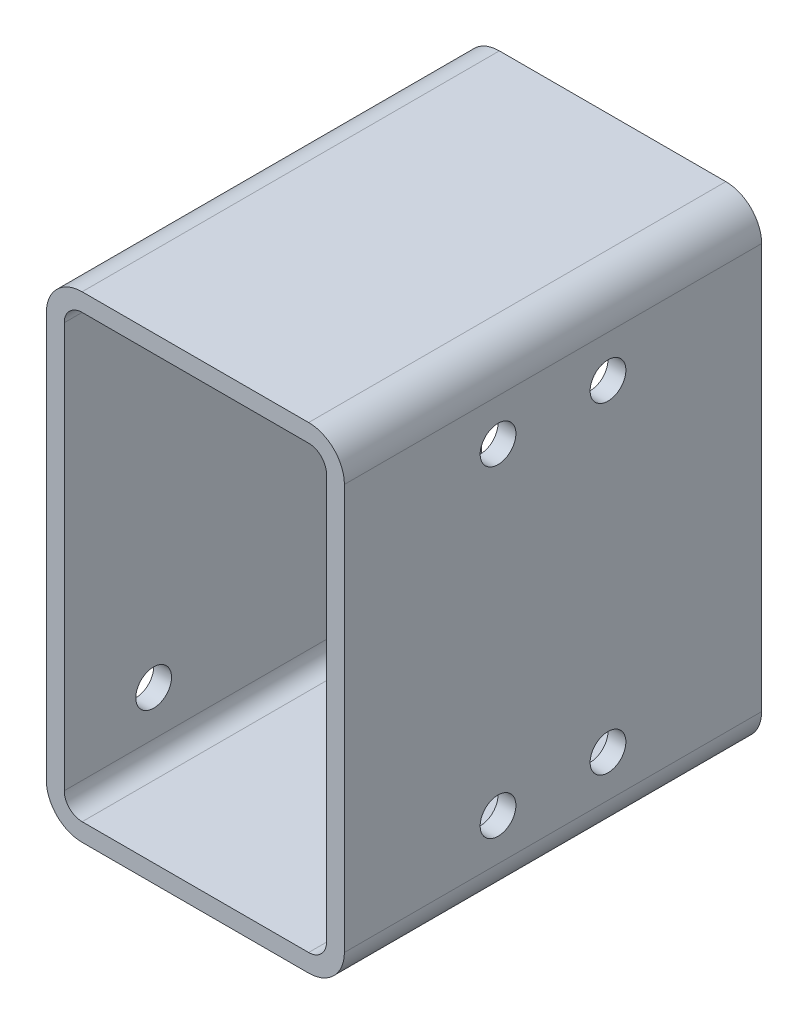
ISO-10303-21;
HEADER;
FILE_DESCRIPTION(('STEP AP214'),'2;1');
FILE_NAME('part.step','',(''),(''),'','','');
FILE_SCHEMA(('AUTOMOTIVE_DESIGN { 1 0 10303 214 1 1 1 1 }'));
ENDSEC;
DATA;
#1=APPLICATION_CONTEXT('core data for automotive mechanical design processes');
#2=APPLICATION_PROTOCOL_DEFINITION('international standard','automotive_design',2000,#1);
#3=PRODUCT_CONTEXT('',#1,'mechanical');
#4=PRODUCT('Part','Part','',(#3));
#5=PRODUCT_RELATED_PRODUCT_CATEGORY('part','',(#4));
#6=PRODUCT_DEFINITION_FORMATION('','',#4);
#7=PRODUCT_DEFINITION_CONTEXT('part definition',#1,'design');
#8=PRODUCT_DEFINITION('design','',#6,#7);
#9=PRODUCT_DEFINITION_SHAPE('','',#8);
#10=(LENGTH_UNIT() NAMED_UNIT(*) SI_UNIT(.MILLI.,.METRE.));
#11=(NAMED_UNIT(*) PLANE_ANGLE_UNIT() SI_UNIT($,.RADIAN.));
#12=(NAMED_UNIT(*) SI_UNIT($,.STERADIAN.) SOLID_ANGLE_UNIT());
#13=UNCERTAINTY_MEASURE_WITH_UNIT(LENGTH_MEASURE(1.E-05),#10,'distance_accuracy_value','');
#14=(GEOMETRIC_REPRESENTATION_CONTEXT(3) GLOBAL_UNCERTAINTY_ASSIGNED_CONTEXT((#13)) GLOBAL_UNIT_ASSIGNED_CONTEXT((#10,
#11,#12)) REPRESENTATION_CONTEXT('',''));
#15=CARTESIAN_POINT('',(0.,0.,0.));
#16=DIRECTION('',(0.,0.,1.));
#17=DIRECTION('',(1.,0.,0.));
#18=AXIS2_PLACEMENT_3D('',#15,#16,#17);
#19=CARTESIAN_POINT('',(19.,34.,35.));
#20=DIRECTION('',(0.,0.,1.));
#21=DIRECTION('',(1.,0.,0.));
#22=AXIS2_PLACEMENT_3D('',#19,#20,#21);
#23=PLANE('',#22);
#24=CARTESIAN_POINT('',(19.,34.,35.));
#25=DIRECTION('',(0.,0.,1.));
#26=DIRECTION('',(1.,0.,0.));
#27=AXIS2_PLACEMENT_3D('',#24,#25,#26);
#28=CIRCLE('',#27,6.00000000000001);
#29=CARTESIAN_POINT('',(25.,34.,35.));
#30=VERTEX_POINT('',#29);
#31=CARTESIAN_POINT('',(19.,40.,35.));
#32=VERTEX_POINT('',#31);
#33=EDGE_CURVE('E215',#30,#32,#28,.T.);
#34=ORIENTED_EDGE('',*,*,#33,.T.);
#35=DIRECTION('',(-1.,0.,0.));
#36=VECTOR('',#35,1.);
#37=CARTESIAN_POINT('',(19.,40.,35.));
#38=LINE('',#37,#36);
#39=CARTESIAN_POINT('',(-19.,40.,35.));
#40=VERTEX_POINT('',#39);
#41=EDGE_CURVE('E218',#32,#40,#38,.T.);
#42=ORIENTED_EDGE('',*,*,#41,.T.);
#43=CARTESIAN_POINT('',(-19.,34.,35.));
#44=DIRECTION('',(0.,0.,1.));
#45=DIRECTION('',(1.,0.,0.));
#46=AXIS2_PLACEMENT_3D('',#43,#44,#45);
#47=CIRCLE('',#46,6.);
#48=CARTESIAN_POINT('',(-25.,34.,35.));
#49=VERTEX_POINT('',#48);
#50=EDGE_CURVE('E221',#40,#49,#47,.T.);
#51=ORIENTED_EDGE('',*,*,#50,.T.);
#52=DIRECTION('',(0.,-1.,0.));
#53=VECTOR('',#52,1.);
#54=CARTESIAN_POINT('',(-25.,34.,35.));
#55=LINE('',#54,#53);
#56=CARTESIAN_POINT('',(-25.,-34.,35.));
#57=VERTEX_POINT('',#56);
#58=EDGE_CURVE('E223',#49,#57,#55,.T.);
#59=ORIENTED_EDGE('',*,*,#58,.T.);
#60=CARTESIAN_POINT('',(-19.,-34.,35.));
#61=DIRECTION('',(0.,0.,1.));
#62=DIRECTION('',(1.,0.,0.));
#63=AXIS2_PLACEMENT_3D('',#60,#61,#62);
#64=CIRCLE('',#63,6.00000000000001);
#65=CARTESIAN_POINT('',(-19.,-40.,35.));
#66=VERTEX_POINT('',#65);
#67=EDGE_CURVE('E225',#57,#66,#64,.T.);
#68=ORIENTED_EDGE('',*,*,#67,.T.);
#69=DIRECTION('',(1.,0.,0.));
#70=VECTOR('',#69,1.);
#71=CARTESIAN_POINT('',(-19.,-40.,35.));
#72=LINE('',#71,#70);
#73=CARTESIAN_POINT('',(19.,-40.,35.));
#74=VERTEX_POINT('',#73);
#75=EDGE_CURVE('E227',#66,#74,#72,.T.);
#76=ORIENTED_EDGE('',*,*,#75,.T.);
#77=CARTESIAN_POINT('',(19.,-34.,35.));
#78=DIRECTION('',(0.,0.,1.));
#79=DIRECTION('',(1.,0.,0.));
#80=AXIS2_PLACEMENT_3D('',#77,#78,#79);
#81=CIRCLE('',#80,6.);
#82=CARTESIAN_POINT('',(25.,-34.,35.));
#83=VERTEX_POINT('',#82);
#84=EDGE_CURVE('E229',#74,#83,#81,.T.);
#85=ORIENTED_EDGE('',*,*,#84,.T.);
#86=DIRECTION('',(0.,1.,0.));
#87=VECTOR('',#86,1.);
#88=CARTESIAN_POINT('',(25.,-34.,35.));
#89=LINE('',#88,#87);
#90=EDGE_CURVE('E231',#83,#30,#89,.T.);
#91=ORIENTED_EDGE('',*,*,#90,.T.);
#92=EDGE_LOOP('',(#34,#42,#51,#59,#68,#76,#85,#91));
#93=FACE_BOUND('',#92,.T.);
#94=DIRECTION('',(0.,1.,0.));
#95=VECTOR('',#94,1.);
#96=CARTESIAN_POINT('',(22.,-34.,35.));
#97=LINE('',#96,#95);
#98=CARTESIAN_POINT('',(22.,-34.,35.));
#99=VERTEX_POINT('',#98);
#100=CARTESIAN_POINT('',(22.,34.,35.));
#101=VERTEX_POINT('',#100);
#102=EDGE_CURVE('E156',#99,#101,#97,.T.);
#103=ORIENTED_EDGE('',*,*,#102,.F.);
#104=CARTESIAN_POINT('',(19.,-34.,35.));
#105=DIRECTION('',(0.,0.,1.));
#106=DIRECTION('',(1.,0.,0.));
#107=AXIS2_PLACEMENT_3D('',#104,#105,#106);
#108=CIRCLE('',#107,3.);
#109=CARTESIAN_POINT('',(19.,-37.,35.));
#110=VERTEX_POINT('',#109);
#111=EDGE_CURVE('E148',#110,#99,#108,.T.);
#112=ORIENTED_EDGE('',*,*,#111,.F.);
#113=DIRECTION('',(1.,0.,0.));
#114=VECTOR('',#113,1.);
#115=CARTESIAN_POINT('',(-19.,-37.,35.));
#116=LINE('',#115,#114);
#117=CARTESIAN_POINT('',(-19.,-37.,35.));
#118=VERTEX_POINT('',#117);
#119=EDGE_CURVE('E182',#118,#110,#116,.T.);
#120=ORIENTED_EDGE('',*,*,#119,.F.);
#121=CARTESIAN_POINT('',(-19.,-34.,35.));
#122=DIRECTION('',(0.,0.,1.));
#123=DIRECTION('',(1.,0.,0.));
#124=AXIS2_PLACEMENT_3D('',#121,#122,#123);
#125=CIRCLE('',#124,3.);
#126=CARTESIAN_POINT('',(-22.,-34.,35.));
#127=VERTEX_POINT('',#126);
#128=EDGE_CURVE('E180',#127,#118,#125,.T.);
#129=ORIENTED_EDGE('',*,*,#128,.F.);
#130=DIRECTION('',(0.,-1.,0.));
#131=VECTOR('',#130,1.);
#132=CARTESIAN_POINT('',(-22.,34.,35.));
#133=LINE('',#132,#131);
#134=CARTESIAN_POINT('',(-22.,34.,35.));
#135=VERTEX_POINT('',#134);
#136=EDGE_CURVE('E178',#135,#127,#133,.T.);
#137=ORIENTED_EDGE('',*,*,#136,.F.);
#138=CARTESIAN_POINT('',(-19.,34.,35.));
#139=DIRECTION('',(0.,0.,1.));
#140=DIRECTION('',(1.,0.,0.));
#141=AXIS2_PLACEMENT_3D('',#138,#139,#140);
#142=CIRCLE('',#141,3.);
#143=CARTESIAN_POINT('',(-19.,37.,35.));
#144=VERTEX_POINT('',#143);
#145=EDGE_CURVE('E176',#144,#135,#142,.T.);
#146=ORIENTED_EDGE('',*,*,#145,.F.);
#147=DIRECTION('',(-1.,0.,0.));
#148=VECTOR('',#147,1.);
#149=CARTESIAN_POINT('',(19.,37.,35.));
#150=LINE('',#149,#148);
#151=CARTESIAN_POINT('',(19.,37.,35.));
#152=VERTEX_POINT('',#151);
#153=EDGE_CURVE('E171',#152,#144,#150,.T.);
#154=ORIENTED_EDGE('',*,*,#153,.F.);
#155=CARTESIAN_POINT('',(19.,34.,35.));
#156=DIRECTION('',(0.,0.,1.));
#157=DIRECTION('',(1.,0.,0.));
#158=AXIS2_PLACEMENT_3D('',#155,#156,#157);
#159=CIRCLE('',#158,3.);
#160=EDGE_CURVE('E169',#101,#152,#159,.T.);
#161=ORIENTED_EDGE('',*,*,#160,.F.);
#162=EDGE_LOOP('',(#103,#112,#120,#129,#137,#146,#154,#161));
#163=FACE_BOUND('',#162,.T.);
#164=ADVANCED_FACE('F33',(#93,#163),#23,.T.);
#165=CARTESIAN_POINT('',(19.,34.,-35.));
#166=DIRECTION('',(0.,0.,1.));
#167=DIRECTION('',(1.,0.,0.));
#168=AXIS2_PLACEMENT_3D('',#165,#166,#167);
#169=PLANE('',#168);
#170=CARTESIAN_POINT('',(19.,34.,-35.));
#171=DIRECTION('',(0.,0.,1.));
#172=DIRECTION('',(1.,0.,0.));
#173=AXIS2_PLACEMENT_3D('',#170,#171,#172);
#174=CIRCLE('',#173,6.00000000000001);
#175=CARTESIAN_POINT('',(25.,34.,-35.));
#176=VERTEX_POINT('',#175);
#177=CARTESIAN_POINT('',(19.,40.,-35.));
#178=VERTEX_POINT('',#177);
#179=EDGE_CURVE('E164',#176,#178,#174,.T.);
#180=ORIENTED_EDGE('',*,*,#179,.F.);
#181=DIRECTION('',(0.,1.,0.));
#182=VECTOR('',#181,1.);
#183=CARTESIAN_POINT('',(25.,-34.,-35.));
#184=LINE('',#183,#182);
#185=CARTESIAN_POINT('',(25.,-34.,-35.));
#186=VERTEX_POINT('',#185);
#187=EDGE_CURVE('E219',#186,#176,#184,.T.);
#188=ORIENTED_EDGE('',*,*,#187,.F.);
#189=CARTESIAN_POINT('',(19.,-34.,-35.));
#190=DIRECTION('',(0.,0.,1.));
#191=DIRECTION('',(1.,0.,0.));
#192=AXIS2_PLACEMENT_3D('',#189,#190,#191);
#193=CIRCLE('',#192,6.);
#194=CARTESIAN_POINT('',(19.,-40.,-35.));
#195=VERTEX_POINT('',#194);
#196=EDGE_CURVE('E246',#195,#186,#193,.T.);
#197=ORIENTED_EDGE('',*,*,#196,.F.);
#198=DIRECTION('',(1.,0.,0.));
#199=VECTOR('',#198,1.);
#200=CARTESIAN_POINT('',(-19.,-40.,-35.));
#201=LINE('',#200,#199);
#202=CARTESIAN_POINT('',(-19.,-40.,-35.));
#203=VERTEX_POINT('',#202);
#204=EDGE_CURVE('E244',#203,#195,#201,.T.);
#205=ORIENTED_EDGE('',*,*,#204,.F.);
#206=CARTESIAN_POINT('',(-19.,-34.,-35.));
#207=DIRECTION('',(0.,0.,1.));
#208=DIRECTION('',(1.,0.,0.));
#209=AXIS2_PLACEMENT_3D('',#206,#207,#208);
#210=CIRCLE('',#209,6.00000000000001);
#211=CARTESIAN_POINT('',(-25.,-34.,-35.));
#212=VERTEX_POINT('',#211);
#213=EDGE_CURVE('E242',#212,#203,#210,.T.);
#214=ORIENTED_EDGE('',*,*,#213,.F.);
#215=DIRECTION('',(0.,-1.,0.));
#216=VECTOR('',#215,1.);
#217=CARTESIAN_POINT('',(-25.,34.,-35.));
#218=LINE('',#217,#216);
#219=CARTESIAN_POINT('',(-25.,34.,-35.));
#220=VERTEX_POINT('',#219);
#221=EDGE_CURVE('E240',#220,#212,#218,.T.);
#222=ORIENTED_EDGE('',*,*,#221,.F.);
#223=CARTESIAN_POINT('',(-19.,34.,-35.));
#224=DIRECTION('',(0.,0.,1.));
#225=DIRECTION('',(1.,0.,0.));
#226=AXIS2_PLACEMENT_3D('',#223,#224,#225);
#227=CIRCLE('',#226,6.);
#228=CARTESIAN_POINT('',(-19.,40.,-35.));
#229=VERTEX_POINT('',#228);
#230=EDGE_CURVE('E238',#229,#220,#227,.T.);
#231=ORIENTED_EDGE('',*,*,#230,.F.);
#232=DIRECTION('',(-1.,0.,0.));
#233=VECTOR('',#232,1.);
#234=CARTESIAN_POINT('',(19.,40.,-35.));
#235=LINE('',#234,#233);
#236=EDGE_CURVE('E236',#178,#229,#235,.T.);
#237=ORIENTED_EDGE('',*,*,#236,.F.);
#238=EDGE_LOOP('',(#180,#188,#197,#205,#214,#222,#231,#237));
#239=FACE_BOUND('',#238,.T.);
#240=CARTESIAN_POINT('',(19.,-34.,-35.));
#241=DIRECTION('',(0.,0.,1.));
#242=DIRECTION('',(1.,0.,0.));
#243=AXIS2_PLACEMENT_3D('',#240,#241,#242);
#244=CIRCLE('',#243,3.);
#245=CARTESIAN_POINT('',(19.,-37.,-35.));
#246=VERTEX_POINT('',#245);
#247=CARTESIAN_POINT('',(22.,-34.,-35.));
#248=VERTEX_POINT('',#247);
#249=EDGE_CURVE('E58',#246,#248,#244,.T.);
#250=ORIENTED_EDGE('',*,*,#249,.T.);
#251=DIRECTION('',(0.,1.,0.));
#252=VECTOR('',#251,1.);
#253=CARTESIAN_POINT('',(22.,-34.,-35.));
#254=LINE('',#253,#252);
#255=CARTESIAN_POINT('',(22.,34.,-35.));
#256=VERTEX_POINT('',#255);
#257=EDGE_CURVE('E163',#248,#256,#254,.T.);
#258=ORIENTED_EDGE('',*,*,#257,.T.);
#259=CARTESIAN_POINT('',(19.,34.,-35.));
#260=DIRECTION('',(0.,0.,1.));
#261=DIRECTION('',(1.,0.,0.));
#262=AXIS2_PLACEMENT_3D('',#259,#260,#261);
#263=CIRCLE('',#262,3.);
#264=CARTESIAN_POINT('',(19.,37.,-35.));
#265=VERTEX_POINT('',#264);
#266=EDGE_CURVE('E187',#256,#265,#263,.T.);
#267=ORIENTED_EDGE('',*,*,#266,.T.);
#268=DIRECTION('',(-1.,0.,0.));
#269=VECTOR('',#268,1.);
#270=CARTESIAN_POINT('',(19.,37.,-35.));
#271=LINE('',#270,#269);
#272=CARTESIAN_POINT('',(-19.,37.,-35.));
#273=VERTEX_POINT('',#272);
#274=EDGE_CURVE('E190',#265,#273,#271,.T.);
#275=ORIENTED_EDGE('',*,*,#274,.T.);
#276=CARTESIAN_POINT('',(-19.,34.,-35.));
#277=DIRECTION('',(0.,0.,1.));
#278=DIRECTION('',(1.,0.,0.));
#279=AXIS2_PLACEMENT_3D('',#276,#277,#278);
#280=CIRCLE('',#279,3.);
#281=CARTESIAN_POINT('',(-22.,34.,-35.));
#282=VERTEX_POINT('',#281);
#283=EDGE_CURVE('E193',#273,#282,#280,.T.);
#284=ORIENTED_EDGE('',*,*,#283,.T.);
#285=DIRECTION('',(0.,-1.,0.));
#286=VECTOR('',#285,1.);
#287=CARTESIAN_POINT('',(-22.,34.,-35.));
#288=LINE('',#287,#286);
#289=CARTESIAN_POINT('',(-22.,-34.,-35.));
#290=VERTEX_POINT('',#289);
#291=EDGE_CURVE('E196',#282,#290,#288,.T.);
#292=ORIENTED_EDGE('',*,*,#291,.T.);
#293=CARTESIAN_POINT('',(-19.,-34.,-35.));
#294=DIRECTION('',(0.,0.,1.));
#295=DIRECTION('',(1.,0.,0.));
#296=AXIS2_PLACEMENT_3D('',#293,#294,#295);
#297=CIRCLE('',#296,3.);
#298=CARTESIAN_POINT('',(-19.,-37.,-35.));
#299=VERTEX_POINT('',#298);
#300=EDGE_CURVE('E199',#290,#299,#297,.T.);
#301=ORIENTED_EDGE('',*,*,#300,.T.);
#302=DIRECTION('',(1.,0.,0.));
#303=VECTOR('',#302,1.);
#304=CARTESIAN_POINT('',(-19.,-37.,-35.));
#305=LINE('',#304,#303);
#306=EDGE_CURVE('E157',#299,#246,#305,.T.);
#307=ORIENTED_EDGE('',*,*,#306,.T.);
#308=EDGE_LOOP('',(#250,#258,#267,#275,#284,#292,#301,#307));
#309=FACE_BOUND('',#308,.T.);
#310=ADVANCED_FACE('F334',(#239,#309),#169,.F.);
#311=CARTESIAN_POINT('',(19.,34.,35.));
#312=DIRECTION('',(0.,0.,-1.));
#313=DIRECTION('',(-1.,0.,0.));
#314=AXIS2_PLACEMENT_3D('',#311,#312,#313);
#315=CYLINDRICAL_SURFACE('',#314,6.00000000000001);
#316=ORIENTED_EDGE('',*,*,#179,.T.);
#317=DIRECTION('',(0.,0.,-1.));
#318=VECTOR('',#317,1.);
#319=CARTESIAN_POINT('',(19.,40.,35.));
#320=LINE('',#319,#318);
#321=EDGE_CURVE('E11',#32,#178,#320,.T.);
#322=ORIENTED_EDGE('',*,*,#321,.F.);
#323=ORIENTED_EDGE('',*,*,#33,.F.);
#324=DIRECTION('',(0.,0.,-1.));
#325=VECTOR('',#324,1.);
#326=CARTESIAN_POINT('',(25.,34.,35.));
#327=LINE('',#326,#325);
#328=EDGE_CURVE('E233',#30,#176,#327,.T.);
#329=ORIENTED_EDGE('',*,*,#328,.T.);
#330=EDGE_LOOP('',(#316,#322,#323,#329));
#331=FACE_BOUND('',#330,.T.);
#332=ADVANCED_FACE('F35',(#331),#315,.T.);
#333=CARTESIAN_POINT('',(19.,40.,35.));
#334=DIRECTION('',(0.,-1.,0.));
#335=DIRECTION('',(1.,0.,0.));
#336=AXIS2_PLACEMENT_3D('',#333,#334,#335);
#337=PLANE('',#336);
#338=ORIENTED_EDGE('',*,*,#236,.T.);
#339=DIRECTION('',(0.,0.,-1.));
#340=VECTOR('',#339,1.);
#341=CARTESIAN_POINT('',(-19.,40.,35.));
#342=LINE('',#341,#340);
#343=EDGE_CURVE('E42',#40,#229,#342,.T.);
#344=ORIENTED_EDGE('',*,*,#343,.F.);
#345=ORIENTED_EDGE('',*,*,#41,.F.);
#346=ORIENTED_EDGE('',*,*,#321,.T.);
#347=EDGE_LOOP('',(#338,#344,#345,#346));
#348=FACE_BOUND('',#347,.T.);
#349=ADVANCED_FACE('F354',(#348),#337,.F.);
#350=CARTESIAN_POINT('',(-19.,34.,35.));
#351=DIRECTION('',(0.,0.,-1.));
#352=DIRECTION('',(-1.,0.,0.));
#353=AXIS2_PLACEMENT_3D('',#350,#351,#352);
#354=CYLINDRICAL_SURFACE('',#353,6.);
#355=ORIENTED_EDGE('',*,*,#230,.T.);
#356=DIRECTION('',(0.,0.,-1.));
#357=VECTOR('',#356,1.);
#358=CARTESIAN_POINT('',(-25.,34.,35.));
#359=LINE('',#358,#357);
#360=EDGE_CURVE('E263',#49,#220,#359,.T.);
#361=ORIENTED_EDGE('',*,*,#360,.F.);
#362=ORIENTED_EDGE('',*,*,#50,.F.);
#363=ORIENTED_EDGE('',*,*,#343,.T.);
#364=EDGE_LOOP('',(#355,#361,#362,#363));
#365=FACE_BOUND('',#364,.T.);
#366=ADVANCED_FACE('F319',(#365),#354,.T.);
#367=CARTESIAN_POINT('',(-25.,34.,35.));
#368=DIRECTION('',(1.,0.,0.));
#369=DIRECTION('',(0.,1.,0.));
#370=AXIS2_PLACEMENT_3D('',#367,#368,#369);
#371=PLANE('',#370);
#372=CARTESIAN_POINT('',(-25.,26.5,20.));
#373=DIRECTION('',(-1.,0.,0.));
#374=DIRECTION('',(0.,-1.,0.));
#375=AXIS2_PLACEMENT_3D('',#372,#373,#374);
#376=CIRCLE('',#375,3.);
#377=CARTESIAN_POINT('',(-25.,23.5,20.));
#378=VERTEX_POINT('',#377);
#379=EDGE_CURVE('E275',#378,#378,#376,.T.);
#380=ORIENTED_EDGE('',*,*,#379,.F.);
#381=EDGE_LOOP('',(#380));
#382=FACE_BOUND('',#381,.T.);
#383=CARTESIAN_POINT('',(-25.,-26.5,20.));
#384=DIRECTION('',(-1.,0.,0.));
#385=DIRECTION('',(0.,-1.,0.));
#386=AXIS2_PLACEMENT_3D('',#383,#384,#385);
#387=CIRCLE('',#386,3.);
#388=CARTESIAN_POINT('',(-25.,-29.5,20.));
#389=VERTEX_POINT('',#388);
#390=EDGE_CURVE('E306',#389,#389,#387,.T.);
#391=ORIENTED_EDGE('',*,*,#390,.F.);
#392=EDGE_LOOP('',(#391));
#393=FACE_BOUND('',#392,.T.);
#394=CARTESIAN_POINT('',(-25.,-26.5,-20.));
#395=DIRECTION('',(-1.,0.,0.));
#396=DIRECTION('',(0.,-1.,0.));
#397=AXIS2_PLACEMENT_3D('',#394,#395,#396);
#398=CIRCLE('',#397,3.);
#399=CARTESIAN_POINT('',(-25.,-29.5,-20.));
#400=VERTEX_POINT('',#399);
#401=EDGE_CURVE('E284',#400,#400,#398,.T.);
#402=ORIENTED_EDGE('',*,*,#401,.F.);
#403=EDGE_LOOP('',(#402));
#404=FACE_BOUND('',#403,.T.);
#405=CARTESIAN_POINT('',(-25.,26.5,-20.));
#406=DIRECTION('',(-1.,0.,0.));
#407=DIRECTION('',(0.,-1.,0.));
#408=AXIS2_PLACEMENT_3D('',#405,#406,#407);
#409=CIRCLE('',#408,3.);
#410=CARTESIAN_POINT('',(-25.,23.5,-20.));
#411=VERTEX_POINT('',#410);
#412=EDGE_CURVE('E270',#411,#411,#409,.T.);
#413=ORIENTED_EDGE('',*,*,#412,.F.);
#414=EDGE_LOOP('',(#413));
#415=FACE_BOUND('',#414,.T.);
#416=ORIENTED_EDGE('',*,*,#221,.T.);
#417=DIRECTION('',(0.,0.,-1.));
#418=VECTOR('',#417,1.);
#419=CARTESIAN_POINT('',(-25.,-34.,35.));
#420=LINE('',#419,#418);
#421=EDGE_CURVE('E260',#57,#212,#420,.T.);
#422=ORIENTED_EDGE('',*,*,#421,.F.);
#423=ORIENTED_EDGE('',*,*,#58,.F.);
#424=ORIENTED_EDGE('',*,*,#360,.T.);
#425=EDGE_LOOP('',(#416,#422,#423,#424));
#426=FACE_BOUND('',#425,.T.);
#427=ADVANCED_FACE('F315',(#382,#393,#404,#415,#426),#371,.F.);
#428=CARTESIAN_POINT('',(-19.,-34.,35.));
#429=DIRECTION('',(0.,0.,-1.));
#430=DIRECTION('',(-1.,0.,0.));
#431=AXIS2_PLACEMENT_3D('',#428,#429,#430);
#432=CYLINDRICAL_SURFACE('',#431,6.00000000000001);
#433=ORIENTED_EDGE('',*,*,#213,.T.);
#434=DIRECTION('',(0.,0.,-1.));
#435=VECTOR('',#434,1.);
#436=CARTESIAN_POINT('',(-19.,-40.,35.));
#437=LINE('',#436,#435);
#438=EDGE_CURVE('E257',#66,#203,#437,.T.);
#439=ORIENTED_EDGE('',*,*,#438,.F.);
#440=ORIENTED_EDGE('',*,*,#67,.F.);
#441=ORIENTED_EDGE('',*,*,#421,.T.);
#442=EDGE_LOOP('',(#433,#439,#440,#441));
#443=FACE_BOUND('',#442,.T.);
#444=ADVANCED_FACE('F318',(#443),#432,.T.);
#445=CARTESIAN_POINT('',(-19.,-40.,35.));
#446=DIRECTION('',(0.,1.,0.));
#447=DIRECTION('',(-1.,0.,0.));
#448=AXIS2_PLACEMENT_3D('',#445,#446,#447);
#449=PLANE('',#448);
#450=ORIENTED_EDGE('',*,*,#204,.T.);
#451=DIRECTION('',(0.,0.,-1.));
#452=VECTOR('',#451,1.);
#453=CARTESIAN_POINT('',(19.,-40.,35.));
#454=LINE('',#453,#452);
#455=EDGE_CURVE('E254',#74,#195,#454,.T.);
#456=ORIENTED_EDGE('',*,*,#455,.F.);
#457=ORIENTED_EDGE('',*,*,#75,.F.);
#458=ORIENTED_EDGE('',*,*,#438,.T.);
#459=EDGE_LOOP('',(#450,#456,#457,#458));
#460=FACE_BOUND('',#459,.T.);
#461=ADVANCED_FACE('F340',(#460),#449,.F.);
#462=CARTESIAN_POINT('',(19.,-34.,35.));
#463=DIRECTION('',(0.,0.,-1.));
#464=DIRECTION('',(-1.,0.,0.));
#465=AXIS2_PLACEMENT_3D('',#462,#463,#464);
#466=CYLINDRICAL_SURFACE('',#465,6.);
#467=ORIENTED_EDGE('',*,*,#196,.T.);
#468=DIRECTION('',(0.,0.,-1.));
#469=VECTOR('',#468,1.);
#470=CARTESIAN_POINT('',(25.,-34.,35.));
#471=LINE('',#470,#469);
#472=EDGE_CURVE('E251',#83,#186,#471,.T.);
#473=ORIENTED_EDGE('',*,*,#472,.F.);
#474=ORIENTED_EDGE('',*,*,#84,.F.);
#475=ORIENTED_EDGE('',*,*,#455,.T.);
#476=EDGE_LOOP('',(#467,#473,#474,#475));
#477=FACE_BOUND('',#476,.T.);
#478=ADVANCED_FACE('F344',(#477),#466,.T.);
#479=CARTESIAN_POINT('',(25.,-34.,35.));
#480=DIRECTION('',(-1.,0.,0.));
#481=DIRECTION('',(0.,-1.,0.));
#482=AXIS2_PLACEMENT_3D('',#479,#480,#481);
#483=PLANE('',#482);
#484=CARTESIAN_POINT('',(25.,27.,-9.225));
#485=DIRECTION('',(1.,0.,0.));
#486=DIRECTION('',(0.,1.,0.));
#487=AXIS2_PLACEMENT_3D('',#484,#485,#486);
#488=CIRCLE('',#487,3.);
#489=CARTESIAN_POINT('',(25.,30.,-9.225));
#490=VERTEX_POINT('',#489);
#491=EDGE_CURVE('E289',#490,#490,#488,.T.);
#492=ORIENTED_EDGE('',*,*,#491,.F.);
#493=EDGE_LOOP('',(#492));
#494=FACE_BOUND('',#493,.T.);
#495=CARTESIAN_POINT('',(25.,-27.,-9.225));
#496=DIRECTION('',(1.,0.,0.));
#497=DIRECTION('',(0.,1.,0.));
#498=AXIS2_PLACEMENT_3D('',#495,#496,#497);
#499=CIRCLE('',#498,3.);
#500=CARTESIAN_POINT('',(25.,-24.,-9.225));
#501=VERTEX_POINT('',#500);
#502=EDGE_CURVE('E435',#501,#501,#499,.T.);
#503=ORIENTED_EDGE('',*,*,#502,.F.);
#504=EDGE_LOOP('',(#503));
#505=FACE_BOUND('',#504,.T.);
#506=CARTESIAN_POINT('',(25.,-27.,9.225));
#507=DIRECTION('',(1.,0.,0.));
#508=DIRECTION('',(0.,1.,0.));
#509=AXIS2_PLACEMENT_3D('',#506,#507,#508);
#510=CIRCLE('',#509,3.);
#511=CARTESIAN_POINT('',(25.,-24.,9.225));
#512=VERTEX_POINT('',#511);
#513=EDGE_CURVE('E302',#512,#512,#510,.T.);
#514=ORIENTED_EDGE('',*,*,#513,.F.);
#515=EDGE_LOOP('',(#514));
#516=FACE_BOUND('',#515,.T.);
#517=CARTESIAN_POINT('',(25.,27.,9.225));
#518=DIRECTION('',(1.,0.,0.));
#519=DIRECTION('',(0.,1.,0.));
#520=AXIS2_PLACEMENT_3D('',#517,#518,#519);
#521=CIRCLE('',#520,3.);
#522=CARTESIAN_POINT('',(25.,30.,9.225));
#523=VERTEX_POINT('',#522);
#524=EDGE_CURVE('E285',#523,#523,#521,.T.);
#525=ORIENTED_EDGE('',*,*,#524,.F.);
#526=EDGE_LOOP('',(#525));
#527=FACE_BOUND('',#526,.T.);
#528=ORIENTED_EDGE('',*,*,#187,.T.);
#529=ORIENTED_EDGE('',*,*,#328,.F.);
#530=ORIENTED_EDGE('',*,*,#90,.F.);
#531=ORIENTED_EDGE('',*,*,#472,.T.);
#532=EDGE_LOOP('',(#528,#529,#530,#531));
#533=FACE_BOUND('',#532,.T.);
#534=ADVANCED_FACE('F358',(#494,#505,#516,#527,#533),#483,.F.);
#535=CARTESIAN_POINT('',(19.,-34.,35.));
#536=DIRECTION('',(0.,0.,-1.));
#537=DIRECTION('',(-1.,0.,0.));
#538=AXIS2_PLACEMENT_3D('',#535,#536,#537);
#539=CYLINDRICAL_SURFACE('',#538,3.);
#540=ORIENTED_EDGE('',*,*,#249,.F.);
#541=DIRECTION('',(0.,0.,-1.));
#542=VECTOR('',#541,1.);
#543=CARTESIAN_POINT('',(19.,-37.,35.));
#544=LINE('',#543,#542);
#545=EDGE_CURVE('E152',#110,#246,#544,.T.);
#546=ORIENTED_EDGE('',*,*,#545,.F.);
#547=ORIENTED_EDGE('',*,*,#111,.T.);
#548=DIRECTION('',(0.,0.,-1.));
#549=VECTOR('',#548,1.);
#550=CARTESIAN_POINT('',(22.,-34.,35.));
#551=LINE('',#550,#549);
#552=EDGE_CURVE('E151',#99,#248,#551,.T.);
#553=ORIENTED_EDGE('',*,*,#552,.T.);
#554=EDGE_LOOP('',(#540,#546,#547,#553));
#555=FACE_BOUND('',#554,.T.);
#556=ADVANCED_FACE('F150',(#555),#539,.F.);
#557=CARTESIAN_POINT('',(22.,-34.,35.));
#558=DIRECTION('',(-1.,0.,0.));
#559=DIRECTION('',(0.,-1.,0.));
#560=AXIS2_PLACEMENT_3D('',#557,#558,#559);
#561=PLANE('',#560);
#562=CARTESIAN_POINT('',(22.,27.,-9.225));
#563=DIRECTION('',(-1.,0.,0.));
#564=DIRECTION('',(0.,-1.,0.));
#565=AXIS2_PLACEMENT_3D('',#562,#563,#564);
#566=CIRCLE('',#565,3.);
#567=CARTESIAN_POINT('',(22.,24.,-9.225));
#568=VERTEX_POINT('',#567);
#569=EDGE_CURVE('E37',#568,#568,#566,.T.);
#570=ORIENTED_EDGE('',*,*,#569,.F.);
#571=EDGE_LOOP('',(#570));
#572=FACE_BOUND('',#571,.T.);
#573=CARTESIAN_POINT('',(22.,-27.,-9.225));
#574=DIRECTION('',(-1.,0.,0.));
#575=DIRECTION('',(0.,-1.,0.));
#576=AXIS2_PLACEMENT_3D('',#573,#574,#575);
#577=CIRCLE('',#576,3.);
#578=CARTESIAN_POINT('',(22.,-30.,-9.225));
#579=VERTEX_POINT('',#578);
#580=EDGE_CURVE('E288',#579,#579,#577,.T.);
#581=ORIENTED_EDGE('',*,*,#580,.F.);
#582=EDGE_LOOP('',(#581));
#583=FACE_BOUND('',#582,.T.);
#584=CARTESIAN_POINT('',(22.,-27.,9.225));
#585=DIRECTION('',(-1.,0.,0.));
#586=DIRECTION('',(0.,-1.,0.));
#587=AXIS2_PLACEMENT_3D('',#584,#585,#586);
#588=CIRCLE('',#587,3.);
#589=CARTESIAN_POINT('',(22.,-30.,9.225));
#590=VERTEX_POINT('',#589);
#591=EDGE_CURVE('E286',#590,#590,#588,.T.);
#592=ORIENTED_EDGE('',*,*,#591,.F.);
#593=EDGE_LOOP('',(#592));
#594=FACE_BOUND('',#593,.T.);
#595=CARTESIAN_POINT('',(22.,27.,9.225));
#596=DIRECTION('',(-1.,0.,0.));
#597=DIRECTION('',(0.,-1.,0.));
#598=AXIS2_PLACEMENT_3D('',#595,#596,#597);
#599=CIRCLE('',#598,3.);
#600=CARTESIAN_POINT('',(22.,24.,9.225));
#601=VERTEX_POINT('',#600);
#602=EDGE_CURVE('E281',#601,#601,#599,.T.);
#603=ORIENTED_EDGE('',*,*,#602,.F.);
#604=EDGE_LOOP('',(#603));
#605=FACE_BOUND('',#604,.T.);
#606=ORIENTED_EDGE('',*,*,#257,.F.);
#607=ORIENTED_EDGE('',*,*,#552,.F.);
#608=ORIENTED_EDGE('',*,*,#102,.T.);
#609=DIRECTION('',(0.,0.,-1.));
#610=VECTOR('',#609,1.);
#611=CARTESIAN_POINT('',(22.,34.,35.));
#612=LINE('',#611,#610);
#613=EDGE_CURVE('E165',#101,#256,#612,.T.);
#614=ORIENTED_EDGE('',*,*,#613,.T.);
#615=EDGE_LOOP('',(#606,#607,#608,#614));
#616=FACE_BOUND('',#615,.T.);
#617=ADVANCED_FACE('F160',(#572,#583,#594,#605,#616),#561,.T.);
#618=CARTESIAN_POINT('',(19.,34.,35.));
#619=DIRECTION('',(0.,0.,-1.));
#620=DIRECTION('',(-1.,0.,0.));
#621=AXIS2_PLACEMENT_3D('',#618,#619,#620);
#622=CYLINDRICAL_SURFACE('',#621,3.);
#623=ORIENTED_EDGE('',*,*,#266,.F.);
#624=ORIENTED_EDGE('',*,*,#613,.F.);
#625=ORIENTED_EDGE('',*,*,#160,.T.);
#626=DIRECTION('',(0.,0.,-1.));
#627=VECTOR('',#626,1.);
#628=CARTESIAN_POINT('',(19.,37.,35.));
#629=LINE('',#628,#627);
#630=EDGE_CURVE('E212',#152,#265,#629,.T.);
#631=ORIENTED_EDGE('',*,*,#630,.T.);
#632=EDGE_LOOP('',(#623,#624,#625,#631));
#633=FACE_BOUND('',#632,.T.);
#634=ADVANCED_FACE('F379',(#633),#622,.F.);
#635=CARTESIAN_POINT('',(19.,37.,35.));
#636=DIRECTION('',(0.,-1.,0.));
#637=DIRECTION('',(1.,0.,0.));
#638=AXIS2_PLACEMENT_3D('',#635,#636,#637);
#639=PLANE('',#638);
#640=ORIENTED_EDGE('',*,*,#274,.F.);
#641=ORIENTED_EDGE('',*,*,#630,.F.);
#642=ORIENTED_EDGE('',*,*,#153,.T.);
#643=DIRECTION('',(0.,0.,-1.));
#644=VECTOR('',#643,1.);
#645=CARTESIAN_POINT('',(-19.,37.,35.));
#646=LINE('',#645,#644);
#647=EDGE_CURVE('E210',#144,#273,#646,.T.);
#648=ORIENTED_EDGE('',*,*,#647,.T.);
#649=EDGE_LOOP('',(#640,#641,#642,#648));
#650=FACE_BOUND('',#649,.T.);
#651=ADVANCED_FACE('F383',(#650),#639,.T.);
#652=CARTESIAN_POINT('',(-19.,34.,35.));
#653=DIRECTION('',(0.,0.,-1.));
#654=DIRECTION('',(-1.,0.,0.));
#655=AXIS2_PLACEMENT_3D('',#652,#653,#654);
#656=CYLINDRICAL_SURFACE('',#655,3.);
#657=ORIENTED_EDGE('',*,*,#283,.F.);
#658=ORIENTED_EDGE('',*,*,#647,.F.);
#659=ORIENTED_EDGE('',*,*,#145,.T.);
#660=DIRECTION('',(0.,0.,-1.));
#661=VECTOR('',#660,1.);
#662=CARTESIAN_POINT('',(-22.,34.,35.));
#663=LINE('',#662,#661);
#664=EDGE_CURVE('E208',#135,#282,#663,.T.);
#665=ORIENTED_EDGE('',*,*,#664,.T.);
#666=EDGE_LOOP('',(#657,#658,#659,#665));
#667=FACE_BOUND('',#666,.T.);
#668=ADVANCED_FACE('F387',(#667),#656,.F.);
#669=CARTESIAN_POINT('',(-22.,34.,35.));
#670=DIRECTION('',(1.,0.,0.));
#671=DIRECTION('',(0.,0.,-1.));
#672=AXIS2_PLACEMENT_3D('',#669,#670,#671);
#673=PLANE('',#672);
#674=CARTESIAN_POINT('',(-22.,26.5,20.));
#675=DIRECTION('',(1.,0.,0.));
#676=DIRECTION('',(0.,0.,-1.));
#677=AXIS2_PLACEMENT_3D('',#674,#675,#676);
#678=CIRCLE('',#677,3.);
#679=CARTESIAN_POINT('',(-22.,26.5,17.));
#680=VERTEX_POINT('',#679);
#681=EDGE_CURVE('E278',#680,#680,#678,.T.);
#682=ORIENTED_EDGE('',*,*,#681,.F.);
#683=EDGE_LOOP('',(#682));
#684=FACE_BOUND('',#683,.T.);
#685=CARTESIAN_POINT('',(-22.,-26.5,20.));
#686=DIRECTION('',(1.,0.,0.));
#687=DIRECTION('',(0.,0.,-1.));
#688=AXIS2_PLACEMENT_3D('',#685,#686,#687);
#689=CIRCLE('',#688,3.);
#690=CARTESIAN_POINT('',(-22.,-26.5,17.));
#691=VERTEX_POINT('',#690);
#692=EDGE_CURVE('E274',#691,#691,#689,.T.);
#693=ORIENTED_EDGE('',*,*,#692,.F.);
#694=EDGE_LOOP('',(#693));
#695=FACE_BOUND('',#694,.T.);
#696=CARTESIAN_POINT('',(-22.,-26.5,-20.));
#697=DIRECTION('',(1.,0.,0.));
#698=DIRECTION('',(0.,0.,-1.));
#699=AXIS2_PLACEMENT_3D('',#696,#697,#698);
#700=CIRCLE('',#699,3.);
#701=CARTESIAN_POINT('',(-22.,-26.5,-23.));
#702=VERTEX_POINT('',#701);
#703=EDGE_CURVE('E271',#702,#702,#700,.T.);
#704=ORIENTED_EDGE('',*,*,#703,.F.);
#705=EDGE_LOOP('',(#704));
#706=FACE_BOUND('',#705,.T.);
#707=CARTESIAN_POINT('',(-22.,26.5,-20.));
#708=DIRECTION('',(1.,0.,0.));
#709=DIRECTION('',(0.,0.,-1.));
#710=AXIS2_PLACEMENT_3D('',#707,#708,#709);
#711=CIRCLE('',#710,3.);
#712=CARTESIAN_POINT('',(-22.,26.5,-23.));
#713=VERTEX_POINT('',#712);
#714=EDGE_CURVE('E185',#713,#713,#711,.T.);
#715=ORIENTED_EDGE('',*,*,#714,.F.);
#716=EDGE_LOOP('',(#715));
#717=FACE_BOUND('',#716,.T.);
#718=ORIENTED_EDGE('',*,*,#291,.F.);
#719=ORIENTED_EDGE('',*,*,#664,.F.);
#720=ORIENTED_EDGE('',*,*,#136,.T.);
#721=DIRECTION('',(0.,0.,-1.));
#722=VECTOR('',#721,1.);
#723=CARTESIAN_POINT('',(-22.,-34.,35.));
#724=LINE('',#723,#722);
#725=EDGE_CURVE('E206',#127,#290,#724,.T.);
#726=ORIENTED_EDGE('',*,*,#725,.T.);
#727=EDGE_LOOP('',(#718,#719,#720,#726));
#728=FACE_BOUND('',#727,.T.);
#729=ADVANCED_FACE('F391',(#684,#695,#706,#717,#728),#673,.T.);
#730=CARTESIAN_POINT('',(-19.,-34.,35.));
#731=DIRECTION('',(0.,0.,-1.));
#732=DIRECTION('',(-1.,0.,0.));
#733=AXIS2_PLACEMENT_3D('',#730,#731,#732);
#734=CYLINDRICAL_SURFACE('',#733,3.);
#735=ORIENTED_EDGE('',*,*,#300,.F.);
#736=ORIENTED_EDGE('',*,*,#725,.F.);
#737=ORIENTED_EDGE('',*,*,#128,.T.);
#738=DIRECTION('',(0.,0.,-1.));
#739=VECTOR('',#738,1.);
#740=CARTESIAN_POINT('',(-19.,-37.,35.));
#741=LINE('',#740,#739);
#742=EDGE_CURVE('E50',#118,#299,#741,.T.);
#743=ORIENTED_EDGE('',*,*,#742,.T.);
#744=EDGE_LOOP('',(#735,#736,#737,#743));
#745=FACE_BOUND('',#744,.T.);
#746=ADVANCED_FACE('F395',(#745),#734,.F.);
#747=CARTESIAN_POINT('',(-19.,-37.,35.));
#748=DIRECTION('',(0.,1.,0.));
#749=DIRECTION('',(0.,0.,1.));
#750=AXIS2_PLACEMENT_3D('',#747,#748,#749);
#751=PLANE('',#750);
#752=ORIENTED_EDGE('',*,*,#306,.F.);
#753=ORIENTED_EDGE('',*,*,#742,.F.);
#754=ORIENTED_EDGE('',*,*,#119,.T.);
#755=ORIENTED_EDGE('',*,*,#545,.T.);
#756=EDGE_LOOP('',(#752,#753,#754,#755));
#757=FACE_BOUND('',#756,.T.);
#758=ADVANCED_FACE('F399',(#757),#751,.T.);
#759=CARTESIAN_POINT('',(-4.99999999999999,26.5,-20.));
#760=DIRECTION('',(-1.,0.,0.));
#761=DIRECTION('',(0.,-1.,0.));
#762=AXIS2_PLACEMENT_3D('',#759,#760,#761);
#763=CYLINDRICAL_SURFACE('',#762,3.);
#764=ORIENTED_EDGE('',*,*,#714,.T.);
#765=EDGE_LOOP('',(#764));
#766=FACE_BOUND('',#765,.T.);
#767=ORIENTED_EDGE('',*,*,#412,.T.);
#768=EDGE_LOOP('',(#767));
#769=FACE_BOUND('',#768,.T.);
#770=ADVANCED_FACE('F313',(#766,#769),#763,.F.);
#771=CARTESIAN_POINT('',(-5.,-26.5,-20.));
#772=DIRECTION('',(-1.,0.,0.));
#773=DIRECTION('',(0.,-1.,0.));
#774=AXIS2_PLACEMENT_3D('',#771,#772,#773);
#775=CYLINDRICAL_SURFACE('',#774,3.);
#776=ORIENTED_EDGE('',*,*,#703,.T.);
#777=EDGE_LOOP('',(#776));
#778=FACE_BOUND('',#777,.T.);
#779=ORIENTED_EDGE('',*,*,#401,.T.);
#780=EDGE_LOOP('',(#779));
#781=FACE_BOUND('',#780,.T.);
#782=ADVANCED_FACE('F405',(#778,#781),#775,.F.);
#783=CARTESIAN_POINT('',(-5.,-26.5,20.));
#784=DIRECTION('',(-1.,0.,0.));
#785=DIRECTION('',(0.,-1.,0.));
#786=AXIS2_PLACEMENT_3D('',#783,#784,#785);
#787=CYLINDRICAL_SURFACE('',#786,3.);
#788=ORIENTED_EDGE('',*,*,#692,.T.);
#789=EDGE_LOOP('',(#788));
#790=FACE_BOUND('',#789,.T.);
#791=ORIENTED_EDGE('',*,*,#390,.T.);
#792=EDGE_LOOP('',(#791));
#793=FACE_BOUND('',#792,.T.);
#794=ADVANCED_FACE('F409',(#790,#793),#787,.F.);
#795=CARTESIAN_POINT('',(-4.99999999999999,26.5,20.));
#796=DIRECTION('',(-1.,0.,0.));
#797=DIRECTION('',(0.,-1.,0.));
#798=AXIS2_PLACEMENT_3D('',#795,#796,#797);
#799=CYLINDRICAL_SURFACE('',#798,3.);
#800=ORIENTED_EDGE('',*,*,#681,.T.);
#801=EDGE_LOOP('',(#800));
#802=FACE_BOUND('',#801,.T.);
#803=ORIENTED_EDGE('',*,*,#379,.T.);
#804=EDGE_LOOP('',(#803));
#805=FACE_BOUND('',#804,.T.);
#806=ADVANCED_FACE('F413',(#802,#805),#799,.F.);
#807=CARTESIAN_POINT('',(5.00000000000001,27.,9.225));
#808=DIRECTION('',(1.,0.,0.));
#809=DIRECTION('',(0.,1.,0.));
#810=AXIS2_PLACEMENT_3D('',#807,#808,#809);
#811=CYLINDRICAL_SURFACE('',#810,3.);
#812=ORIENTED_EDGE('',*,*,#602,.T.);
#813=EDGE_LOOP('',(#812));
#814=FACE_BOUND('',#813,.T.);
#815=ORIENTED_EDGE('',*,*,#524,.T.);
#816=EDGE_LOOP('',(#815));
#817=FACE_BOUND('',#816,.T.);
#818=ADVANCED_FACE('F417',(#814,#817),#811,.F.);
#819=CARTESIAN_POINT('',(5.00000000000001,-27.,9.225));
#820=DIRECTION('',(1.,0.,0.));
#821=DIRECTION('',(0.,1.,0.));
#822=AXIS2_PLACEMENT_3D('',#819,#820,#821);
#823=CYLINDRICAL_SURFACE('',#822,3.);
#824=ORIENTED_EDGE('',*,*,#591,.T.);
#825=EDGE_LOOP('',(#824));
#826=FACE_BOUND('',#825,.T.);
#827=ORIENTED_EDGE('',*,*,#513,.T.);
#828=EDGE_LOOP('',(#827));
#829=FACE_BOUND('',#828,.T.);
#830=ADVANCED_FACE('F421',(#826,#829),#823,.F.);
#831=CARTESIAN_POINT('',(5.00000000000001,-27.,-9.225));
#832=DIRECTION('',(1.,0.,0.));
#833=DIRECTION('',(0.,1.,0.));
#834=AXIS2_PLACEMENT_3D('',#831,#832,#833);
#835=CYLINDRICAL_SURFACE('',#834,3.);
#836=ORIENTED_EDGE('',*,*,#580,.T.);
#837=EDGE_LOOP('',(#836));
#838=FACE_BOUND('',#837,.T.);
#839=ORIENTED_EDGE('',*,*,#502,.T.);
#840=EDGE_LOOP('',(#839));
#841=FACE_BOUND('',#840,.T.);
#842=ADVANCED_FACE('F425',(#838,#841),#835,.F.);
#843=CARTESIAN_POINT('',(5.00000000000001,27.,-9.225));
#844=DIRECTION('',(1.,0.,0.));
#845=DIRECTION('',(0.,1.,0.));
#846=AXIS2_PLACEMENT_3D('',#843,#844,#845);
#847=CYLINDRICAL_SURFACE('',#846,3.);
#848=ORIENTED_EDGE('',*,*,#569,.T.);
#849=EDGE_LOOP('',(#848));
#850=FACE_BOUND('',#849,.T.);
#851=ORIENTED_EDGE('',*,*,#491,.T.);
#852=EDGE_LOOP('',(#851));
#853=FACE_BOUND('',#852,.T.);
#854=ADVANCED_FACE('F429',(#850,#853),#847,.F.);
#855=CLOSED_SHELL('',(#164,#310,#332,#349,#366,#427,#444,#461,#478,#534,#556,#617,#634,#651,
#668,#729,#746,#758,#770,#782,#794,#806,#818,#830,#842,#854));
#856=MANIFOLD_SOLID_BREP('B2',#855);
#857=ADVANCED_BREP_SHAPE_REPRESENTATION('',(#18,#856),#14);
#858=SHAPE_DEFINITION_REPRESENTATION(#9,#857);
ENDSEC;
END-ISO-10303-21;
